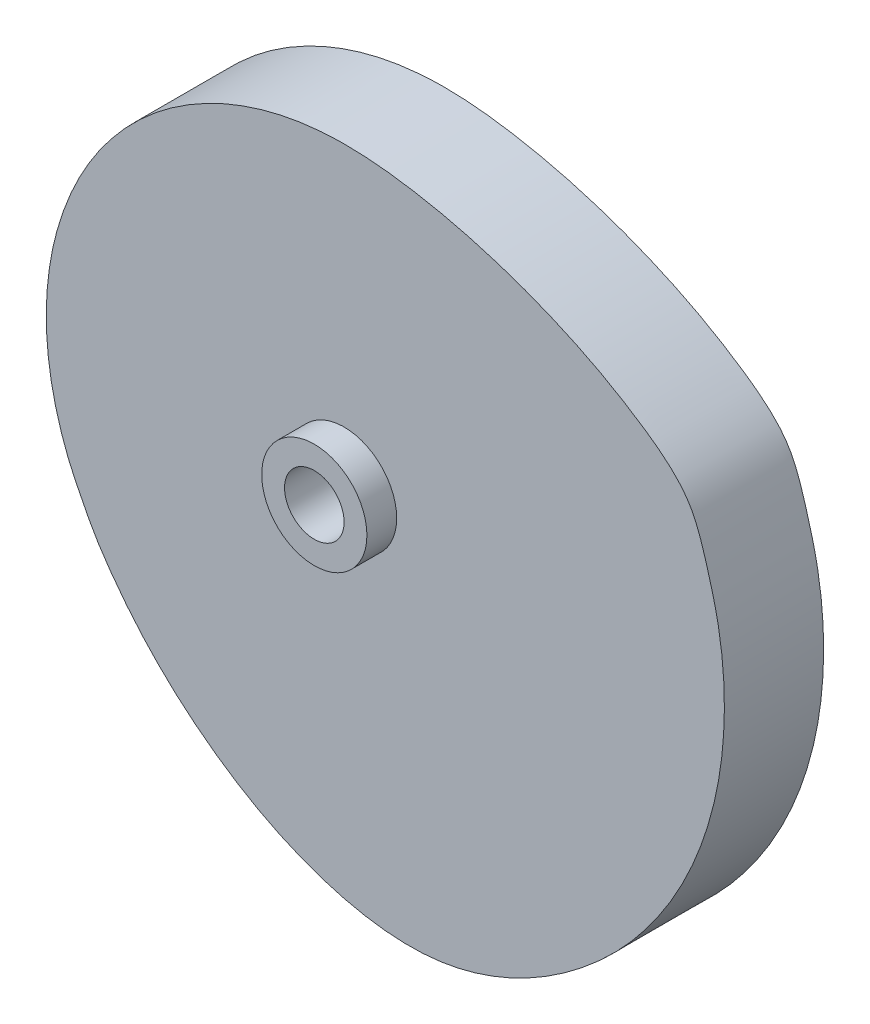
ISO-10303-21;
HEADER;
FILE_DESCRIPTION(('STEP AP214'),'2;1');
FILE_NAME('part.step','',(''),(''),'','','');
FILE_SCHEMA(('AUTOMOTIVE_DESIGN { 1 0 10303 214 1 1 1 1 }'));
ENDSEC;
DATA;
#1=APPLICATION_CONTEXT('core data for automotive mechanical design processes');
#2=APPLICATION_PROTOCOL_DEFINITION('international standard','automotive_design',2000,#1);
#3=PRODUCT_CONTEXT('',#1,'mechanical');
#4=PRODUCT('Part','Part','',(#3));
#5=PRODUCT_RELATED_PRODUCT_CATEGORY('part','',(#4));
#6=PRODUCT_DEFINITION_FORMATION('','',#4);
#7=PRODUCT_DEFINITION_CONTEXT('part definition',#1,'design');
#8=PRODUCT_DEFINITION('design','',#6,#7);
#9=PRODUCT_DEFINITION_SHAPE('','',#8);
#10=(LENGTH_UNIT() NAMED_UNIT(*) SI_UNIT(.MILLI.,.METRE.));
#11=(NAMED_UNIT(*) PLANE_ANGLE_UNIT() SI_UNIT($,.RADIAN.));
#12=(NAMED_UNIT(*) SI_UNIT($,.STERADIAN.) SOLID_ANGLE_UNIT());
#13=UNCERTAINTY_MEASURE_WITH_UNIT(LENGTH_MEASURE(1.E-05),#10,'distance_accuracy_value','');
#14=(GEOMETRIC_REPRESENTATION_CONTEXT(3) GLOBAL_UNCERTAINTY_ASSIGNED_CONTEXT((#13)) GLOBAL_UNIT_ASSIGNED_CONTEXT((#10,
#11,#12)) REPRESENTATION_CONTEXT('',''));
#15=CARTESIAN_POINT('',(0.,0.,0.));
#16=DIRECTION('',(0.,0.,1.));
#17=DIRECTION('',(1.,0.,0.));
#18=AXIS2_PLACEMENT_3D('',#15,#16,#17);
#19=CARTESIAN_POINT('',(89.3208039000866,-365.824166318702,50.));
#20=DIRECTION('',(0.,0.,1.));
#21=DIRECTION('',(1.,0.,0.));
#22=AXIS2_PLACEMENT_3D('',#19,#20,#21);
#23=PLANE('',#22);
#24=CARTESIAN_POINT('',(0.,300.,50.));
#25=CARTESIAN_POINT('',(28.217284294352,300.1128381096,50.));
#26=CARTESIAN_POINT('',(66.2765950474562,295.282252174418,50.));
#27=CARTESIAN_POINT('',(111.565208623105,285.423132424432,50.));
#28=CARTESIAN_POINT('',(161.284807346777,272.184396433255,50.));
#29=CARTESIAN_POINT('',(209.23558938205,254.28082369891,50.));
#30=CARTESIAN_POINT('',(261.445170780224,228.313222155538,50.));
#31=CARTESIAN_POINT('',(297.292905913473,206.82569069031,50.));
#32=CARTESIAN_POINT('',(327.504630593282,185.22284704559,50.));
#33=CARTESIAN_POINT('',(352.626738940583,156.04180591558,50.));
#34=CARTESIAN_POINT('',(364.770823043102,118.585486356375,50.));
#35=CARTESIAN_POINT('',(379.665136205176,63.6071597544373,50.));
#36=CARTESIAN_POINT('',(385.609143923293,-4.49471525343223,50.));
#37=CARTESIAN_POINT('',(379.40343102861,-61.9330628434846,50.));
#38=CARTESIAN_POINT('',(365.39592635646,-118.456456886384,50.));
#39=CARTESIAN_POINT('',(347.285627361943,-166.480326076313,50.));
#40=CARTESIAN_POINT('',(315.570685665377,-219.654716634091,50.));
#41=CARTESIAN_POINT('',(276.37254476979,-267.847841334871,50.));
#42=CARTESIAN_POINT('',(238.171213694002,-301.613772526955,50.));
#43=CARTESIAN_POINT('',(180.451433662892,-340.51449536126,50.));
#44=CARTESIAN_POINT('',(129.998904787167,-361.653313602202,50.));
#45=CARTESIAN_POINT('',(49.2381935239516,-370.131031579556,50.));
#46=CARTESIAN_POINT('',(-37.2499843750343,-353.541488622637,50.));
#47=CARTESIAN_POINT('',(-132.261264159416,-299.789278474094,50.));
#48=CARTESIAN_POINT('',(-195.504173635138,-241.717489504627,50.));
#49=CARTESIAN_POINT('',(-232.091752611031,-195.938121230337,50.));
#50=CARTESIAN_POINT('',(-251.676728282913,-166.831639165331,50.));
#51=CARTESIAN_POINT('',(-264.947337999934,-140.575383927988,50.));
#52=CARTESIAN_POINT('',(-276.179761459267,-118.494733202927,50.));
#53=CARTESIAN_POINT('',(-289.382474633984,-82.8811528121436,50.));
#54=CARTESIAN_POINT('',(-299.388681324718,-37.6183343162378,50.));
#55=CARTESIAN_POINT('',(-301.025459770593,17.3435064010031,50.));
#56=CARTESIAN_POINT('',(-290.389842377322,90.7643287371308,50.));
#57=CARTESIAN_POINT('',(-252.463458386048,173.744069128508,50.));
#58=CARTESIAN_POINT('',(-183.726156385427,242.286967384819,50.));
#59=CARTESIAN_POINT('',(-116.054741077509,279.325778319527,50.));
#60=CARTESIAN_POINT('',(-55.7758675712588,296.630730617955,50.));
#61=CARTESIAN_POINT('',(-17.9649204718612,299.928160072244,50.));
#62=CARTESIAN_POINT('',(0.,300.,50.));
#63=B_SPLINE_CURVE_WITH_KNOTS('',3,(#24,#25,#26,#27,#28,#29,#30,#31,#32,#33,#34,#35,#36,#37,#38,
#39,#40,#41,#42,#43,#44,#45,#46,#47,#48,#49,#50,#51,#52,#53,#54,#55,#56,#57,#58,#59,#60,#61,
#62),.UNSPECIFIED.,.T.,.F.,(4,1,1,1,1,1,1,1,1,1,1,1,1,1,1,1,1,1,1,1,1,1,1,1,1,1,1,1,1,1,1,1,1,1,
1,1,4),(0.,0.039986784704611,0.0539907863972108,0.0657589636185638,0.112949929362138,
0.126217292039116,0.148413251398344,0.172286890633849,0.178369732307952,0.202736339177587,
0.226604211810311,0.259581526339549,0.298860400383207,0.30790718835851,0.342171357334516,
0.371156012925109,0.395355152099684,0.43007409290173,0.442890692093359,0.494201300670637,
0.504983741292244,0.557915928149399,0.615297228371203,0.658028610927806,0.67883406637955,
0.698358602800267,0.707628949509277,0.720547531529394,0.733466113549512,0.761410310391884,
0.785860238242829,0.811057768884591,0.866204857210203,0.911632798846538,0.94645390220692,
0.974541865912746,1.),.UNSPECIFIED.);
#64=CARTESIAN_POINT('',(0.,300.,50.));
#65=VERTEX_POINT('',#64);
#66=EDGE_CURVE('E10',#65,#65,#63,.T.);
#67=ORIENTED_EDGE('',*,*,#66,.F.);
#68=EDGE_LOOP('',(#67));
#69=FACE_BOUND('',#68,.T.);
#70=CARTESIAN_POINT('',(0.,0.,50.));
#71=DIRECTION('',(0.,0.,1.));
#72=DIRECTION('',(1.,0.,0.));
#73=AXIS2_PLACEMENT_3D('',#70,#71,#72);
#74=CIRCLE('',#73,53.);
#75=CARTESIAN_POINT('',(53.,0.,50.));
#76=VERTEX_POINT('',#75);
#77=EDGE_CURVE('E55',#76,#76,#74,.T.);
#78=ORIENTED_EDGE('',*,*,#77,.F.);
#79=EDGE_LOOP('',(#78));
#80=FACE_BOUND('',#79,.T.);
#81=ADVANCED_FACE('F37',(#69,#80),#23,.T.);
#82=DIRECTION('',(0.,0.,-1.));
#83=VECTOR('',#82,1.);
#84=SURFACE_OF_LINEAR_EXTRUSION('',#63,#83);
#85=ORIENTED_EDGE('',*,*,#66,.T.);
#86=EDGE_LOOP('',(#85));
#87=FACE_BOUND('',#86,.T.);
#88=CARTESIAN_POINT('',(0.,300.,-50.));
#89=CARTESIAN_POINT('',(28.217284294352,300.1128381096,-50.));
#90=CARTESIAN_POINT('',(66.2765950474562,295.282252174418,-50.));
#91=CARTESIAN_POINT('',(111.565208623105,285.423132424432,-50.));
#92=CARTESIAN_POINT('',(161.284807346777,272.184396433255,-50.));
#93=CARTESIAN_POINT('',(209.23558938205,254.28082369891,-50.));
#94=CARTESIAN_POINT('',(261.445170780224,228.313222155538,-50.));
#95=CARTESIAN_POINT('',(297.292905913473,206.82569069031,-50.));
#96=CARTESIAN_POINT('',(327.504630593282,185.22284704559,-50.));
#97=CARTESIAN_POINT('',(352.626738940583,156.04180591558,-50.));
#98=CARTESIAN_POINT('',(364.770823043102,118.585486356375,-50.));
#99=CARTESIAN_POINT('',(379.665136205176,63.6071597544373,-50.));
#100=CARTESIAN_POINT('',(385.609143923293,-4.49471525343223,-50.));
#101=CARTESIAN_POINT('',(379.40343102861,-61.9330628434846,-50.));
#102=CARTESIAN_POINT('',(365.39592635646,-118.456456886384,-50.));
#103=CARTESIAN_POINT('',(347.285627361943,-166.480326076313,-50.));
#104=CARTESIAN_POINT('',(315.570685665377,-219.654716634091,-50.));
#105=CARTESIAN_POINT('',(276.37254476979,-267.847841334871,-50.));
#106=CARTESIAN_POINT('',(238.171213694002,-301.613772526955,-50.));
#107=CARTESIAN_POINT('',(180.451433662892,-340.51449536126,-50.));
#108=CARTESIAN_POINT('',(129.998904787167,-361.653313602202,-50.));
#109=CARTESIAN_POINT('',(49.2381935239516,-370.131031579556,-50.));
#110=CARTESIAN_POINT('',(-37.2499843750343,-353.541488622637,-50.));
#111=CARTESIAN_POINT('',(-132.261264159416,-299.789278474094,-50.));
#112=CARTESIAN_POINT('',(-195.504173635138,-241.717489504627,-50.));
#113=CARTESIAN_POINT('',(-232.091752611031,-195.938121230337,-50.));
#114=CARTESIAN_POINT('',(-251.676728282913,-166.831639165331,-50.));
#115=CARTESIAN_POINT('',(-264.947337999934,-140.575383927988,-50.));
#116=CARTESIAN_POINT('',(-276.179761459267,-118.494733202927,-50.));
#117=CARTESIAN_POINT('',(-289.382474633984,-82.8811528121436,-50.));
#118=CARTESIAN_POINT('',(-299.388681324718,-37.6183343162378,-50.));
#119=CARTESIAN_POINT('',(-301.025459770593,17.3435064010031,-50.));
#120=CARTESIAN_POINT('',(-290.389842377322,90.7643287371308,-50.));
#121=CARTESIAN_POINT('',(-252.463458386048,173.744069128508,-50.));
#122=CARTESIAN_POINT('',(-183.726156385427,242.286967384819,-50.));
#123=CARTESIAN_POINT('',(-116.054741077509,279.325778319527,-50.));
#124=CARTESIAN_POINT('',(-55.7758675712588,296.630730617955,-50.));
#125=CARTESIAN_POINT('',(-17.9649204718612,299.928160072244,-50.));
#126=CARTESIAN_POINT('',(0.,300.,-50.));
#127=B_SPLINE_CURVE_WITH_KNOTS('',3,(#88,#89,#90,#91,#92,#93,#94,#95,#96,#97,#98,#99,#100,#101,
#102,#103,#104,#105,#106,#107,#108,#109,#110,#111,#112,#113,#114,#115,#116,#117,#118,#119,#120,
#121,#122,#123,#124,#125,#126),.UNSPECIFIED.,.T.,.F.,(4,1,1,1,1,1,1,1,1,1,1,1,1,1,1,1,1,1,1,1,1,
1,1,1,1,1,1,1,1,1,1,1,1,1,1,1,4),(0.,0.039986784704611,0.0539907863972108,0.0657589636185638,
0.112949929362138,0.126217292039116,0.148413251398344,0.172286890633849,0.178369732307952,
0.202736339177587,0.226604211810311,0.259581526339549,0.298860400383207,0.30790718835851,
0.342171357334516,0.371156012925109,0.395355152099684,0.43007409290173,0.442890692093359,
0.494201300670637,0.504983741292244,0.557915928149399,0.615297228371203,0.658028610927806,
0.67883406637955,0.698358602800267,0.707628949509277,0.720547531529394,0.733466113549512,
0.761410310391884,0.785860238242829,0.811057768884591,0.866204857210203,0.911632798846538,
0.94645390220692,0.974541865912746,1.),.UNSPECIFIED.);
#128=CARTESIAN_POINT('',(0.,300.,-50.));
#129=VERTEX_POINT('',#128);
#130=EDGE_CURVE('E42',#129,#129,#127,.T.);
#131=ORIENTED_EDGE('',*,*,#130,.F.);
#132=EDGE_LOOP('',(#131));
#133=FACE_BOUND('',#132,.T.);
#134=ADVANCED_FACE('F39',(#87,#133),#84,.T.);
#135=CARTESIAN_POINT('',(89.3208039000866,-365.824166318702,-50.));
#136=DIRECTION('',(0.,0.,1.));
#137=DIRECTION('',(1.,0.,0.));
#138=AXIS2_PLACEMENT_3D('',#135,#136,#137);
#139=PLANE('',#138);
#140=CARTESIAN_POINT('',(0.,0.,-50.));
#141=DIRECTION('',(0.,0.,1.));
#142=DIRECTION('',(1.,0.,0.));
#143=AXIS2_PLACEMENT_3D('',#140,#141,#142);
#144=CIRCLE('',#143,53.);
#145=CARTESIAN_POINT('',(53.,0.,-50.));
#146=VERTEX_POINT('',#145);
#147=EDGE_CURVE('E67',#146,#146,#144,.T.);
#148=ORIENTED_EDGE('',*,*,#147,.T.);
#149=EDGE_LOOP('',(#148));
#150=FACE_BOUND('',#149,.T.);
#151=ORIENTED_EDGE('',*,*,#130,.T.);
#152=EDGE_LOOP('',(#151));
#153=FACE_BOUND('',#152,.T.);
#154=ADVANCED_FACE('F82',(#150,#153),#139,.F.);
#155=CARTESIAN_POINT('',(0.,0.,-120.));
#156=DIRECTION('',(0.,0.,1.));
#157=DIRECTION('',(1.,0.,0.));
#158=AXIS2_PLACEMENT_3D('',#155,#156,#157);
#159=CYLINDRICAL_SURFACE('',#158,30.);
#160=CARTESIAN_POINT('',(0.,0.,80.));
#161=DIRECTION('',(0.,0.,1.));
#162=DIRECTION('',(1.,0.,0.));
#163=AXIS2_PLACEMENT_3D('',#160,#161,#162);
#164=CIRCLE('',#163,30.);
#165=CARTESIAN_POINT('',(30.,0.,80.));
#166=VERTEX_POINT('',#165);
#167=EDGE_CURVE('E61',#166,#166,#164,.T.);
#168=ORIENTED_EDGE('',*,*,#167,.T.);
#169=EDGE_LOOP('',(#168));
#170=FACE_BOUND('',#169,.T.);
#171=CARTESIAN_POINT('',(0.,0.,-80.));
#172=DIRECTION('',(0.,0.,1.));
#173=DIRECTION('',(1.,0.,0.));
#174=AXIS2_PLACEMENT_3D('',#171,#172,#173);
#175=CIRCLE('',#174,30.);
#176=CARTESIAN_POINT('',(30.,0.,-80.));
#177=VERTEX_POINT('',#176);
#178=EDGE_CURVE('E70',#177,#177,#175,.T.);
#179=ORIENTED_EDGE('',*,*,#178,.F.);
#180=EDGE_LOOP('',(#179));
#181=FACE_BOUND('',#180,.T.);
#182=ADVANCED_FACE('F79',(#170,#181),#159,.F.);
#183=CARTESIAN_POINT('',(0.,0.,80.));
#184=DIRECTION('',(0.,0.,1.));
#185=DIRECTION('',(1.,0.,0.));
#186=AXIS2_PLACEMENT_3D('',#183,#184,#185);
#187=PLANE('',#186);
#188=CARTESIAN_POINT('',(0.,0.,80.));
#189=DIRECTION('',(0.,0.,1.));
#190=DIRECTION('',(1.,0.,0.));
#191=AXIS2_PLACEMENT_3D('',#188,#189,#190);
#192=CIRCLE('',#191,53.);
#193=CARTESIAN_POINT('',(53.,0.,80.));
#194=VERTEX_POINT('',#193);
#195=EDGE_CURVE('E50',#194,#194,#192,.T.);
#196=ORIENTED_EDGE('',*,*,#195,.T.);
#197=EDGE_LOOP('',(#196));
#198=FACE_BOUND('',#197,.T.);
#199=ORIENTED_EDGE('',*,*,#167,.F.);
#200=EDGE_LOOP('',(#199));
#201=FACE_BOUND('',#200,.T.);
#202=ADVANCED_FACE('F81',(#198,#201),#187,.T.);
#203=CARTESIAN_POINT('',(0.,0.,80.));
#204=DIRECTION('',(0.,0.,-1.));
#205=DIRECTION('',(-1.,0.,0.));
#206=AXIS2_PLACEMENT_3D('',#203,#204,#205);
#207=CYLINDRICAL_SURFACE('',#206,53.);
#208=ORIENTED_EDGE('',*,*,#195,.F.);
#209=EDGE_LOOP('',(#208));
#210=FACE_BOUND('',#209,.T.);
#211=ORIENTED_EDGE('',*,*,#77,.T.);
#212=EDGE_LOOP('',(#211));
#213=FACE_BOUND('',#212,.T.);
#214=ADVANCED_FACE('F89',(#210,#213),#207,.T.);
#215=CARTESIAN_POINT('',(0.,0.,-80.));
#216=DIRECTION('',(0.,0.,1.));
#217=DIRECTION('',(1.,0.,0.));
#218=AXIS2_PLACEMENT_3D('',#215,#216,#217);
#219=CYLINDRICAL_SURFACE('',#218,53.);
#220=CARTESIAN_POINT('',(0.,0.,-80.));
#221=DIRECTION('',(0.,0.,1.));
#222=DIRECTION('',(1.,0.,0.));
#223=AXIS2_PLACEMENT_3D('',#220,#221,#222);
#224=CIRCLE('',#223,53.);
#225=CARTESIAN_POINT('',(53.,0.,-80.));
#226=VERTEX_POINT('',#225);
#227=EDGE_CURVE('E66',#226,#226,#224,.T.);
#228=ORIENTED_EDGE('',*,*,#227,.T.);
#229=EDGE_LOOP('',(#228));
#230=FACE_BOUND('',#229,.T.);
#231=ORIENTED_EDGE('',*,*,#147,.F.);
#232=EDGE_LOOP('',(#231));
#233=FACE_BOUND('',#232,.T.);
#234=ADVANCED_FACE('F104',(#230,#233),#219,.T.);
#235=CARTESIAN_POINT('',(0.,0.,-80.));
#236=DIRECTION('',(0.,0.,-1.));
#237=DIRECTION('',(1.,0.,0.));
#238=AXIS2_PLACEMENT_3D('',#235,#236,#237);
#239=PLANE('',#238);
#240=ORIENTED_EDGE('',*,*,#178,.T.);
#241=EDGE_LOOP('',(#240));
#242=FACE_BOUND('',#241,.T.);
#243=ORIENTED_EDGE('',*,*,#227,.F.);
#244=EDGE_LOOP('',(#243));
#245=FACE_BOUND('',#244,.T.);
#246=ADVANCED_FACE('F76',(#242,#245),#239,.T.);
#247=CLOSED_SHELL('',(#81,#134,#154,#182,#202,#214,#234,#246));
#248=MANIFOLD_SOLID_BREP('B2',#247);
#249=ADVANCED_BREP_SHAPE_REPRESENTATION('',(#18,#248),#14);
#250=SHAPE_DEFINITION_REPRESENTATION(#9,#249);
ENDSEC;
END-ISO-10303-21;
